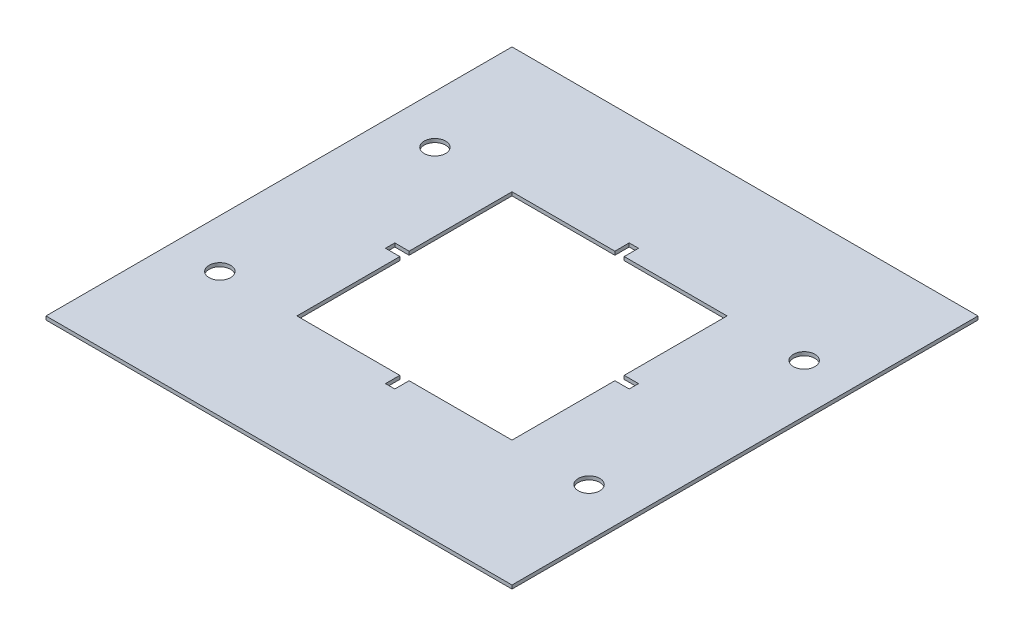
ISO-10303-21;
HEADER;
FILE_DESCRIPTION(('STEP AP214'),'2;1');
FILE_NAME('part.step','',(''),(''),'','','');
FILE_SCHEMA(('AUTOMOTIVE_DESIGN { 1 0 10303 214 1 1 1 1 }'));
ENDSEC;
DATA;
#1=APPLICATION_CONTEXT('core data for automotive mechanical design processes');
#2=APPLICATION_PROTOCOL_DEFINITION('international standard','automotive_design',2000,#1);
#3=PRODUCT_CONTEXT('',#1,'mechanical');
#4=PRODUCT('Part','Part','',(#3));
#5=PRODUCT_RELATED_PRODUCT_CATEGORY('part','',(#4));
#6=PRODUCT_DEFINITION_FORMATION('','',#4);
#7=PRODUCT_DEFINITION_CONTEXT('part definition',#1,'design');
#8=PRODUCT_DEFINITION('design','',#6,#7);
#9=PRODUCT_DEFINITION_SHAPE('','',#8);
#10=(LENGTH_UNIT() NAMED_UNIT(*) SI_UNIT(.MILLI.,.METRE.));
#11=(NAMED_UNIT(*) PLANE_ANGLE_UNIT() SI_UNIT($,.RADIAN.));
#12=(NAMED_UNIT(*) SI_UNIT($,.STERADIAN.) SOLID_ANGLE_UNIT());
#13=UNCERTAINTY_MEASURE_WITH_UNIT(LENGTH_MEASURE(1.E-05),#10,'distance_accuracy_value','');
#14=(GEOMETRIC_REPRESENTATION_CONTEXT(3) GLOBAL_UNCERTAINTY_ASSIGNED_CONTEXT((#13)) GLOBAL_UNIT_ASSIGNED_CONTEXT((#10,
#11,#12)) REPRESENTATION_CONTEXT('',''));
#15=CARTESIAN_POINT('',(0.,0.,0.));
#16=DIRECTION('',(0.,0.,1.));
#17=DIRECTION('',(1.,0.,0.));
#18=AXIS2_PLACEMENT_3D('',#15,#16,#17);
#19=CARTESIAN_POINT('',(0.,0.5,0.));
#20=DIRECTION('',(0.,-1.,0.));
#21=DIRECTION('',(0.,0.,-1.));
#22=AXIS2_PLACEMENT_3D('',#19,#20,#21);
#23=PLANE('',#22);
#24=DIRECTION('',(-1.,0.,0.));
#25=VECTOR('',#24,1.);
#26=CARTESIAN_POINT('',(28.15,0.5,-42.5));
#27=LINE('',#26,#25);
#28=CARTESIAN_POINT('',(42.5,0.5,-42.5));
#29=VERTEX_POINT('',#28);
#30=CARTESIAN_POINT('',(28.15,0.5,-42.5));
#31=VERTEX_POINT('',#30);
#32=EDGE_CURVE('E258',#29,#31,#27,.T.);
#33=ORIENTED_EDGE('',*,*,#32,.F.);
#34=DIRECTION('',(0.,0.,-1.));
#35=VECTOR('',#34,1.);
#36=CARTESIAN_POINT('',(42.5,0.5,-28.15));
#37=LINE('',#36,#35);
#38=CARTESIAN_POINT('',(42.5,0.5,-28.15));
#39=VERTEX_POINT('',#38);
#40=EDGE_CURVE('E297',#39,#29,#37,.T.);
#41=ORIENTED_EDGE('',*,*,#40,.F.);
#42=DIRECTION('',(-1.,0.,0.));
#43=VECTOR('',#42,1.);
#44=CARTESIAN_POINT('',(44.5,0.5,-28.15));
#45=LINE('',#44,#43);
#46=CARTESIAN_POINT('',(44.5,0.5,-28.15));
#47=VERTEX_POINT('',#46);
#48=EDGE_CURVE('E295',#47,#39,#45,.T.);
#49=ORIENTED_EDGE('',*,*,#48,.F.);
#50=DIRECTION('',(0.,0.,-1.));
#51=VECTOR('',#50,1.);
#52=CARTESIAN_POINT('',(44.5,0.5,-28.15));
#53=LINE('',#52,#51);
#54=CARTESIAN_POINT('',(44.5,0.5,-26.85));
#55=VERTEX_POINT('',#54);
#56=EDGE_CURVE('E293',#55,#47,#53,.T.);
#57=ORIENTED_EDGE('',*,*,#56,.F.);
#58=DIRECTION('',(1.,0.,0.));
#59=VECTOR('',#58,1.);
#60=CARTESIAN_POINT('',(44.5,0.5,-26.85));
#61=LINE('',#60,#59);
#62=CARTESIAN_POINT('',(42.5,0.5,-26.85));
#63=VERTEX_POINT('',#62);
#64=EDGE_CURVE('E291',#63,#55,#61,.T.);
#65=ORIENTED_EDGE('',*,*,#64,.F.);
#66=DIRECTION('',(0.,0.,-1.));
#67=VECTOR('',#66,1.);
#68=CARTESIAN_POINT('',(42.5,0.5,-12.5));
#69=LINE('',#68,#67);
#70=CARTESIAN_POINT('',(42.5,0.5,-12.5));
#71=VERTEX_POINT('',#70);
#72=EDGE_CURVE('E289',#71,#63,#69,.T.);
#73=ORIENTED_EDGE('',*,*,#72,.F.);
#74=DIRECTION('',(1.,0.,0.));
#75=VECTOR('',#74,1.);
#76=CARTESIAN_POINT('',(28.15,0.5,-12.5));
#77=LINE('',#76,#75);
#78=CARTESIAN_POINT('',(28.15,0.5,-12.5));
#79=VERTEX_POINT('',#78);
#80=EDGE_CURVE('E287',#79,#71,#77,.T.);
#81=ORIENTED_EDGE('',*,*,#80,.F.);
#82=DIRECTION('',(0.,0.,-1.));
#83=VECTOR('',#82,1.);
#84=CARTESIAN_POINT('',(28.15,0.5,-10.5));
#85=LINE('',#84,#83);
#86=CARTESIAN_POINT('',(28.15,0.5,-10.5));
#87=VERTEX_POINT('',#86);
#88=EDGE_CURVE('E285',#87,#79,#85,.T.);
#89=ORIENTED_EDGE('',*,*,#88,.F.);
#90=DIRECTION('',(1.,0.,0.));
#91=VECTOR('',#90,1.);
#92=CARTESIAN_POINT('',(26.85,0.5,-10.5));
#93=LINE('',#92,#91);
#94=CARTESIAN_POINT('',(26.85,0.5,-10.5));
#95=VERTEX_POINT('',#94);
#96=EDGE_CURVE('E283',#95,#87,#93,.T.);
#97=ORIENTED_EDGE('',*,*,#96,.F.);
#98=DIRECTION('',(0.,0.,1.));
#99=VECTOR('',#98,1.);
#100=CARTESIAN_POINT('',(26.85,0.5,-10.5));
#101=LINE('',#100,#99);
#102=CARTESIAN_POINT('',(26.85,0.5,-12.5));
#103=VERTEX_POINT('',#102);
#104=EDGE_CURVE('E281',#103,#95,#101,.T.);
#105=ORIENTED_EDGE('',*,*,#104,.F.);
#106=DIRECTION('',(1.,0.,0.));
#107=VECTOR('',#106,1.);
#108=CARTESIAN_POINT('',(12.5,0.5,-12.5));
#109=LINE('',#108,#107);
#110=CARTESIAN_POINT('',(12.5,0.5,-12.5));
#111=VERTEX_POINT('',#110);
#112=EDGE_CURVE('E279',#111,#103,#109,.T.);
#113=ORIENTED_EDGE('',*,*,#112,.F.);
#114=DIRECTION('',(0.,0.,1.));
#115=VECTOR('',#114,1.);
#116=CARTESIAN_POINT('',(12.5,0.5,-12.5));
#117=LINE('',#116,#115);
#118=CARTESIAN_POINT('',(12.5,0.5,-26.85));
#119=VERTEX_POINT('',#118);
#120=EDGE_CURVE('E277',#119,#111,#117,.T.);
#121=ORIENTED_EDGE('',*,*,#120,.F.);
#122=DIRECTION('',(1.,0.,0.));
#123=VECTOR('',#122,1.);
#124=CARTESIAN_POINT('',(10.5,0.5,-26.85));
#125=LINE('',#124,#123);
#126=CARTESIAN_POINT('',(10.5,0.5,-26.85));
#127=VERTEX_POINT('',#126);
#128=EDGE_CURVE('E275',#127,#119,#125,.T.);
#129=ORIENTED_EDGE('',*,*,#128,.F.);
#130=DIRECTION('',(0.,0.,1.));
#131=VECTOR('',#130,1.);
#132=CARTESIAN_POINT('',(10.5,0.5,-28.15));
#133=LINE('',#132,#131);
#134=CARTESIAN_POINT('',(10.5,0.5,-28.15));
#135=VERTEX_POINT('',#134);
#136=EDGE_CURVE('E273',#135,#127,#133,.T.);
#137=ORIENTED_EDGE('',*,*,#136,.F.);
#138=DIRECTION('',(-1.,0.,0.));
#139=VECTOR('',#138,1.);
#140=CARTESIAN_POINT('',(10.5,0.5,-28.15));
#141=LINE('',#140,#139);
#142=CARTESIAN_POINT('',(12.5,0.5,-28.15));
#143=VERTEX_POINT('',#142);
#144=EDGE_CURVE('E271',#143,#135,#141,.T.);
#145=ORIENTED_EDGE('',*,*,#144,.F.);
#146=DIRECTION('',(0.,0.,1.));
#147=VECTOR('',#146,1.);
#148=CARTESIAN_POINT('',(12.5,0.5,-28.15));
#149=LINE('',#148,#147);
#150=CARTESIAN_POINT('',(12.5,0.5,-42.5));
#151=VERTEX_POINT('',#150);
#152=EDGE_CURVE('E269',#151,#143,#149,.T.);
#153=ORIENTED_EDGE('',*,*,#152,.F.);
#154=DIRECTION('',(-1.,0.,0.));
#155=VECTOR('',#154,1.);
#156=CARTESIAN_POINT('',(12.5,0.5,-42.5));
#157=LINE('',#156,#155);
#158=CARTESIAN_POINT('',(26.85,0.5,-42.5));
#159=VERTEX_POINT('',#158);
#160=EDGE_CURVE('E267',#159,#151,#157,.T.);
#161=ORIENTED_EDGE('',*,*,#160,.F.);
#162=DIRECTION('',(0.,0.,1.));
#163=VECTOR('',#162,1.);
#164=CARTESIAN_POINT('',(26.85,0.5,-44.5));
#165=LINE('',#164,#163);
#166=CARTESIAN_POINT('',(26.85,0.5,-44.5));
#167=VERTEX_POINT('',#166);
#168=EDGE_CURVE('E265',#167,#159,#165,.T.);
#169=ORIENTED_EDGE('',*,*,#168,.F.);
#170=DIRECTION('',(-1.,0.,0.));
#171=VECTOR('',#170,1.);
#172=CARTESIAN_POINT('',(26.85,0.5,-44.5));
#173=LINE('',#172,#171);
#174=CARTESIAN_POINT('',(28.15,0.5,-44.5));
#175=VERTEX_POINT('',#174);
#176=EDGE_CURVE('E263',#175,#167,#173,.T.);
#177=ORIENTED_EDGE('',*,*,#176,.F.);
#178=DIRECTION('',(0.,0.,-1.));
#179=VECTOR('',#178,1.);
#180=CARTESIAN_POINT('',(28.15,0.5,-44.5));
#181=LINE('',#180,#179);
#182=EDGE_CURVE('E260',#31,#175,#181,.T.);
#183=ORIENTED_EDGE('',*,*,#182,.F.);
#184=EDGE_LOOP('',(#33,#41,#49,#57,#65,#73,#81,#89,#97,#105,#113,#121,#129,#137,#145,#153,#161,
#169,#177,#183));
#185=FACE_BOUND('',#184,.T.);
#186=CARTESIAN_POINT('',(1.75,0.5,-42.5));
#187=DIRECTION('',(0.,1.,0.));
#188=DIRECTION('',(0.,0.,1.));
#189=AXIS2_PLACEMENT_3D('',#186,#187,#188);
#190=CIRCLE('',#189,1.5);
#191=CARTESIAN_POINT('',(1.75,0.5,-41.));
#192=VERTEX_POINT('',#191);
#193=EDGE_CURVE('E253',#192,#192,#190,.T.);
#194=ORIENTED_EDGE('',*,*,#193,.F.);
#195=EDGE_LOOP('',(#194));
#196=FACE_BOUND('',#195,.T.);
#197=CARTESIAN_POINT('',(1.75,0.5,-12.5));
#198=DIRECTION('',(0.,1.,0.));
#199=DIRECTION('',(0.,0.,1.));
#200=AXIS2_PLACEMENT_3D('',#197,#198,#199);
#201=CIRCLE('',#200,1.5);
#202=CARTESIAN_POINT('',(1.75,0.5,-11.));
#203=VERTEX_POINT('',#202);
#204=EDGE_CURVE('E247',#203,#203,#201,.T.);
#205=ORIENTED_EDGE('',*,*,#204,.F.);
#206=EDGE_LOOP('',(#205));
#207=FACE_BOUND('',#206,.T.);
#208=CARTESIAN_POINT('',(53.25,0.5,-42.5));
#209=DIRECTION('',(0.,1.,0.));
#210=DIRECTION('',(0.,0.,-1.));
#211=AXIS2_PLACEMENT_3D('',#208,#209,#210);
#212=CIRCLE('',#211,1.5);
#213=CARTESIAN_POINT('',(53.25,0.5,-44.));
#214=VERTEX_POINT('',#213);
#215=EDGE_CURVE('E241',#214,#214,#212,.T.);
#216=ORIENTED_EDGE('',*,*,#215,.F.);
#217=EDGE_LOOP('',(#216));
#218=FACE_BOUND('',#217,.T.);
#219=CARTESIAN_POINT('',(53.25,0.5,-12.5));
#220=DIRECTION('',(0.,1.,0.));
#221=DIRECTION('',(0.,0.,-1.));
#222=AXIS2_PLACEMENT_3D('',#219,#220,#221);
#223=CIRCLE('',#222,1.5);
#224=CARTESIAN_POINT('',(53.25,0.5,-14.));
#225=VERTEX_POINT('',#224);
#226=EDGE_CURVE('E233',#225,#225,#223,.T.);
#227=ORIENTED_EDGE('',*,*,#226,.F.);
#228=EDGE_LOOP('',(#227));
#229=FACE_BOUND('',#228,.T.);
#230=DIRECTION('',(0.,0.,1.));
#231=VECTOR('',#230,1.);
#232=CARTESIAN_POINT('',(-4.99999999999999,0.5,5.));
#233=LINE('',#232,#231);
#234=CARTESIAN_POINT('',(-4.99999999999999,0.5,-60.));
#235=VERTEX_POINT('',#234);
#236=CARTESIAN_POINT('',(-4.99999999999999,0.5,5.));
#237=VERTEX_POINT('',#236);
#238=EDGE_CURVE('E218',#235,#237,#233,.T.);
#239=ORIENTED_EDGE('',*,*,#238,.T.);
#240=DIRECTION('',(1.,0.,0.));
#241=VECTOR('',#240,1.);
#242=CARTESIAN_POINT('',(-4.99999999999999,0.5,5.));
#243=LINE('',#242,#241);
#244=CARTESIAN_POINT('',(60.,0.5,4.99999999999999));
#245=VERTEX_POINT('',#244);
#246=EDGE_CURVE('E648',#237,#245,#243,.T.);
#247=ORIENTED_EDGE('',*,*,#246,.T.);
#248=DIRECTION('',(0.,0.,-1.));
#249=VECTOR('',#248,1.);
#250=CARTESIAN_POINT('',(60.,0.5,4.99999999999999));
#251=LINE('',#250,#249);
#252=CARTESIAN_POINT('',(60.,0.5,-60.));
#253=VERTEX_POINT('',#252);
#254=EDGE_CURVE('E214',#245,#253,#251,.T.);
#255=ORIENTED_EDGE('',*,*,#254,.T.);
#256=DIRECTION('',(-1.,0.,0.));
#257=VECTOR('',#256,1.);
#258=CARTESIAN_POINT('',(-4.99999999999999,0.5,-60.));
#259=LINE('',#258,#257);
#260=EDGE_CURVE('E240',#253,#235,#259,.T.);
#261=ORIENTED_EDGE('',*,*,#260,.T.);
#262=EDGE_LOOP('',(#239,#247,#255,#261));
#263=FACE_BOUND('',#262,.T.);
#264=ADVANCED_FACE('F37',(#185,#196,#207,#218,#229,#263),#23,.F.);
#265=CARTESIAN_POINT('',(0.,0.,0.));
#266=DIRECTION('',(0.,-1.,0.));
#267=DIRECTION('',(0.,0.,-1.));
#268=AXIS2_PLACEMENT_3D('',#265,#266,#267);
#269=PLANE('',#268);
#270=CARTESIAN_POINT('',(53.25,0.,-42.5));
#271=DIRECTION('',(0.,1.,0.));
#272=DIRECTION('',(0.,0.,-1.));
#273=AXIS2_PLACEMENT_3D('',#270,#271,#272);
#274=CIRCLE('',#273,1.5);
#275=CARTESIAN_POINT('',(53.25,0.,-44.));
#276=VERTEX_POINT('',#275);
#277=EDGE_CURVE('E236',#276,#276,#274,.T.);
#278=ORIENTED_EDGE('',*,*,#277,.T.);
#279=EDGE_LOOP('',(#278));
#280=FACE_BOUND('',#279,.T.);
#281=CARTESIAN_POINT('',(1.75,0.,-42.5));
#282=DIRECTION('',(0.,1.,0.));
#283=DIRECTION('',(0.,0.,1.));
#284=AXIS2_PLACEMENT_3D('',#281,#282,#283);
#285=CIRCLE('',#284,1.5);
#286=CARTESIAN_POINT('',(1.75,0.,-41.));
#287=VERTEX_POINT('',#286);
#288=EDGE_CURVE('E250',#287,#287,#285,.T.);
#289=ORIENTED_EDGE('',*,*,#288,.T.);
#290=EDGE_LOOP('',(#289));
#291=FACE_BOUND('',#290,.T.);
#292=DIRECTION('',(0.,0.,-1.));
#293=VECTOR('',#292,1.);
#294=CARTESIAN_POINT('',(42.5,0.,-28.15));
#295=LINE('',#294,#293);
#296=CARTESIAN_POINT('',(42.5,0.,-28.15));
#297=VERTEX_POINT('',#296);
#298=CARTESIAN_POINT('',(42.5,0.,-42.5));
#299=VERTEX_POINT('',#298);
#300=EDGE_CURVE('E261',#297,#299,#295,.T.);
#301=ORIENTED_EDGE('',*,*,#300,.T.);
#302=DIRECTION('',(-1.,0.,0.));
#303=VECTOR('',#302,1.);
#304=CARTESIAN_POINT('',(28.15,0.,-42.5));
#305=LINE('',#304,#303);
#306=CARTESIAN_POINT('',(28.15,0.,-42.5));
#307=VERTEX_POINT('',#306);
#308=EDGE_CURVE('E59',#299,#307,#305,.T.);
#309=ORIENTED_EDGE('',*,*,#308,.T.);
#310=DIRECTION('',(0.,0.,-1.));
#311=VECTOR('',#310,1.);
#312=CARTESIAN_POINT('',(28.15,0.,-44.5));
#313=LINE('',#312,#311);
#314=CARTESIAN_POINT('',(28.15,0.,-44.5));
#315=VERTEX_POINT('',#314);
#316=EDGE_CURVE('E301',#307,#315,#313,.T.);
#317=ORIENTED_EDGE('',*,*,#316,.T.);
#318=DIRECTION('',(-1.,0.,0.));
#319=VECTOR('',#318,1.);
#320=CARTESIAN_POINT('',(26.85,0.,-44.5));
#321=LINE('',#320,#319);
#322=CARTESIAN_POINT('',(26.85,0.,-44.5));
#323=VERTEX_POINT('',#322);
#324=EDGE_CURVE('E304',#315,#323,#321,.T.);
#325=ORIENTED_EDGE('',*,*,#324,.T.);
#326=DIRECTION('',(0.,0.,1.));
#327=VECTOR('',#326,1.);
#328=CARTESIAN_POINT('',(26.85,0.,-44.5));
#329=LINE('',#328,#327);
#330=CARTESIAN_POINT('',(26.85,0.,-42.5));
#331=VERTEX_POINT('',#330);
#332=EDGE_CURVE('E307',#323,#331,#329,.T.);
#333=ORIENTED_EDGE('',*,*,#332,.T.);
#334=DIRECTION('',(-1.,0.,0.));
#335=VECTOR('',#334,1.);
#336=CARTESIAN_POINT('',(12.5,0.,-42.5));
#337=LINE('',#336,#335);
#338=CARTESIAN_POINT('',(12.5,0.,-42.5));
#339=VERTEX_POINT('',#338);
#340=EDGE_CURVE('E310',#331,#339,#337,.T.);
#341=ORIENTED_EDGE('',*,*,#340,.T.);
#342=DIRECTION('',(0.,0.,1.));
#343=VECTOR('',#342,1.);
#344=CARTESIAN_POINT('',(12.5,0.,-28.15));
#345=LINE('',#344,#343);
#346=CARTESIAN_POINT('',(12.5,0.,-28.15));
#347=VERTEX_POINT('',#346);
#348=EDGE_CURVE('E313',#339,#347,#345,.T.);
#349=ORIENTED_EDGE('',*,*,#348,.T.);
#350=DIRECTION('',(-1.,0.,0.));
#351=VECTOR('',#350,1.);
#352=CARTESIAN_POINT('',(10.5,0.,-28.15));
#353=LINE('',#352,#351);
#354=CARTESIAN_POINT('',(10.5,0.,-28.15));
#355=VERTEX_POINT('',#354);
#356=EDGE_CURVE('E316',#347,#355,#353,.T.);
#357=ORIENTED_EDGE('',*,*,#356,.T.);
#358=DIRECTION('',(0.,0.,1.));
#359=VECTOR('',#358,1.);
#360=CARTESIAN_POINT('',(10.5,0.,-28.15));
#361=LINE('',#360,#359);
#362=CARTESIAN_POINT('',(10.5,0.,-26.85));
#363=VERTEX_POINT('',#362);
#364=EDGE_CURVE('E319',#355,#363,#361,.T.);
#365=ORIENTED_EDGE('',*,*,#364,.T.);
#366=DIRECTION('',(1.,0.,0.));
#367=VECTOR('',#366,1.);
#368=CARTESIAN_POINT('',(10.5,0.,-26.85));
#369=LINE('',#368,#367);
#370=CARTESIAN_POINT('',(12.5,0.,-26.85));
#371=VERTEX_POINT('',#370);
#372=EDGE_CURVE('E322',#363,#371,#369,.T.);
#373=ORIENTED_EDGE('',*,*,#372,.T.);
#374=DIRECTION('',(0.,0.,1.));
#375=VECTOR('',#374,1.);
#376=CARTESIAN_POINT('',(12.5,0.,-12.5));
#377=LINE('',#376,#375);
#378=CARTESIAN_POINT('',(12.5,0.,-12.5));
#379=VERTEX_POINT('',#378);
#380=EDGE_CURVE('E325',#371,#379,#377,.T.);
#381=ORIENTED_EDGE('',*,*,#380,.T.);
#382=DIRECTION('',(1.,0.,0.));
#383=VECTOR('',#382,1.);
#384=CARTESIAN_POINT('',(12.5,0.,-12.5));
#385=LINE('',#384,#383);
#386=CARTESIAN_POINT('',(26.85,0.,-12.5));
#387=VERTEX_POINT('',#386);
#388=EDGE_CURVE('E328',#379,#387,#385,.T.);
#389=ORIENTED_EDGE('',*,*,#388,.T.);
#390=DIRECTION('',(0.,0.,1.));
#391=VECTOR('',#390,1.);
#392=CARTESIAN_POINT('',(26.85,0.,-10.5));
#393=LINE('',#392,#391);
#394=CARTESIAN_POINT('',(26.85,0.,-10.5));
#395=VERTEX_POINT('',#394);
#396=EDGE_CURVE('E331',#387,#395,#393,.T.);
#397=ORIENTED_EDGE('',*,*,#396,.T.);
#398=DIRECTION('',(1.,0.,0.));
#399=VECTOR('',#398,1.);
#400=CARTESIAN_POINT('',(26.85,0.,-10.5));
#401=LINE('',#400,#399);
#402=CARTESIAN_POINT('',(28.15,0.,-10.5));
#403=VERTEX_POINT('',#402);
#404=EDGE_CURVE('E334',#395,#403,#401,.T.);
#405=ORIENTED_EDGE('',*,*,#404,.T.);
#406=DIRECTION('',(0.,0.,-1.));
#407=VECTOR('',#406,1.);
#408=CARTESIAN_POINT('',(28.15,0.,-10.5));
#409=LINE('',#408,#407);
#410=CARTESIAN_POINT('',(28.15,0.,-12.5));
#411=VERTEX_POINT('',#410);
#412=EDGE_CURVE('E337',#403,#411,#409,.T.);
#413=ORIENTED_EDGE('',*,*,#412,.T.);
#414=DIRECTION('',(1.,0.,0.));
#415=VECTOR('',#414,1.);
#416=CARTESIAN_POINT('',(28.15,0.,-12.5));
#417=LINE('',#416,#415);
#418=CARTESIAN_POINT('',(42.5,0.,-12.5));
#419=VERTEX_POINT('',#418);
#420=EDGE_CURVE('E340',#411,#419,#417,.T.);
#421=ORIENTED_EDGE('',*,*,#420,.T.);
#422=DIRECTION('',(0.,0.,-1.));
#423=VECTOR('',#422,1.);
#424=CARTESIAN_POINT('',(42.5,0.,-12.5));
#425=LINE('',#424,#423);
#426=CARTESIAN_POINT('',(42.5,0.,-26.85));
#427=VERTEX_POINT('',#426);
#428=EDGE_CURVE('E343',#419,#427,#425,.T.);
#429=ORIENTED_EDGE('',*,*,#428,.T.);
#430=DIRECTION('',(1.,0.,0.));
#431=VECTOR('',#430,1.);
#432=CARTESIAN_POINT('',(44.5,0.,-26.85));
#433=LINE('',#432,#431);
#434=CARTESIAN_POINT('',(44.5,0.,-26.85));
#435=VERTEX_POINT('',#434);
#436=EDGE_CURVE('E346',#427,#435,#433,.T.);
#437=ORIENTED_EDGE('',*,*,#436,.T.);
#438=DIRECTION('',(0.,0.,-1.));
#439=VECTOR('',#438,1.);
#440=CARTESIAN_POINT('',(44.5,0.,-28.15));
#441=LINE('',#440,#439);
#442=CARTESIAN_POINT('',(44.5,0.,-28.15));
#443=VERTEX_POINT('',#442);
#444=EDGE_CURVE('E349',#435,#443,#441,.T.);
#445=ORIENTED_EDGE('',*,*,#444,.T.);
#446=DIRECTION('',(-1.,0.,0.));
#447=VECTOR('',#446,1.);
#448=CARTESIAN_POINT('',(44.5,0.,-28.15));
#449=LINE('',#448,#447);
#450=EDGE_CURVE('E352',#443,#297,#449,.T.);
#451=ORIENTED_EDGE('',*,*,#450,.T.);
#452=EDGE_LOOP('',(#301,#309,#317,#325,#333,#341,#349,#357,#365,#373,#381,#389,#397,#405,#413,
#421,#429,#437,#445,#451));
#453=FACE_BOUND('',#452,.T.);
#454=CARTESIAN_POINT('',(1.75,0.,-12.5));
#455=DIRECTION('',(0.,1.,0.));
#456=DIRECTION('',(0.,0.,1.));
#457=AXIS2_PLACEMENT_3D('',#454,#455,#456);
#458=CIRCLE('',#457,1.5);
#459=CARTESIAN_POINT('',(1.75,0.,-11.));
#460=VERTEX_POINT('',#459);
#461=EDGE_CURVE('E244',#460,#460,#458,.T.);
#462=ORIENTED_EDGE('',*,*,#461,.T.);
#463=EDGE_LOOP('',(#462));
#464=FACE_BOUND('',#463,.T.);
#465=CARTESIAN_POINT('',(53.25,0.,-12.5));
#466=DIRECTION('',(0.,1.,0.));
#467=DIRECTION('',(0.,0.,-1.));
#468=AXIS2_PLACEMENT_3D('',#465,#466,#467);
#469=CIRCLE('',#468,1.5);
#470=CARTESIAN_POINT('',(53.25,0.,-14.));
#471=VERTEX_POINT('',#470);
#472=EDGE_CURVE('E237',#471,#471,#469,.T.);
#473=ORIENTED_EDGE('',*,*,#472,.T.);
#474=EDGE_LOOP('',(#473));
#475=FACE_BOUND('',#474,.T.);
#476=DIRECTION('',(0.,0.,1.));
#477=VECTOR('',#476,1.);
#478=CARTESIAN_POINT('',(-4.99999999999999,0.,5.));
#479=LINE('',#478,#477);
#480=CARTESIAN_POINT('',(-4.99999999999999,0.,-60.));
#481=VERTEX_POINT('',#480);
#482=CARTESIAN_POINT('',(-4.99999999999999,0.,5.));
#483=VERTEX_POINT('',#482);
#484=EDGE_CURVE('E228',#481,#483,#479,.T.);
#485=ORIENTED_EDGE('',*,*,#484,.F.);
#486=DIRECTION('',(-1.,0.,0.));
#487=VECTOR('',#486,1.);
#488=CARTESIAN_POINT('',(-4.99999999999999,0.,-60.));
#489=LINE('',#488,#487);
#490=CARTESIAN_POINT('',(60.,0.,-60.));
#491=VERTEX_POINT('',#490);
#492=EDGE_CURVE('E204',#491,#481,#489,.T.);
#493=ORIENTED_EDGE('',*,*,#492,.F.);
#494=DIRECTION('',(0.,0.,-1.));
#495=VECTOR('',#494,1.);
#496=CARTESIAN_POINT('',(60.,0.,4.99999999999999));
#497=LINE('',#496,#495);
#498=CARTESIAN_POINT('',(60.,0.,4.99999999999999));
#499=VERTEX_POINT('',#498);
#500=EDGE_CURVE('E198',#499,#491,#497,.T.);
#501=ORIENTED_EDGE('',*,*,#500,.F.);
#502=DIRECTION('',(1.,0.,0.));
#503=VECTOR('',#502,1.);
#504=CARTESIAN_POINT('',(-4.99999999999999,0.,5.));
#505=LINE('',#504,#503);
#506=EDGE_CURVE('E201',#483,#499,#505,.T.);
#507=ORIENTED_EDGE('',*,*,#506,.F.);
#508=EDGE_LOOP('',(#485,#493,#501,#507));
#509=FACE_BOUND('',#508,.T.);
#510=ADVANCED_FACE('F39',(#280,#291,#453,#464,#475,#509),#269,.T.);
#511=CARTESIAN_POINT('',(28.15,0.5,-42.5));
#512=DIRECTION('',(0.,0.,1.));
#513=DIRECTION('',(1.,0.,0.));
#514=AXIS2_PLACEMENT_3D('',#511,#512,#513);
#515=PLANE('',#514);
#516=ORIENTED_EDGE('',*,*,#308,.F.);
#517=DIRECTION('',(0.,-1.,0.));
#518=VECTOR('',#517,1.);
#519=CARTESIAN_POINT('',(42.5,0.5,-42.5));
#520=LINE('',#519,#518);
#521=EDGE_CURVE('E299',#29,#299,#520,.T.);
#522=ORIENTED_EDGE('',*,*,#521,.F.);
#523=ORIENTED_EDGE('',*,*,#32,.T.);
#524=DIRECTION('',(0.,-1.,0.));
#525=VECTOR('',#524,1.);
#526=CARTESIAN_POINT('',(28.15,0.5,-42.5));
#527=LINE('',#526,#525);
#528=EDGE_CURVE('E11',#31,#307,#527,.T.);
#529=ORIENTED_EDGE('',*,*,#528,.T.);
#530=EDGE_LOOP('',(#516,#522,#523,#529));
#531=FACE_BOUND('',#530,.T.);
#532=ADVANCED_FACE('F407',(#531),#515,.T.);
#533=CARTESIAN_POINT('',(28.15,0.5,-44.5));
#534=DIRECTION('',(-1.,0.,0.));
#535=DIRECTION('',(0.,0.,1.));
#536=AXIS2_PLACEMENT_3D('',#533,#534,#535);
#537=PLANE('',#536);
#538=ORIENTED_EDGE('',*,*,#316,.F.);
#539=ORIENTED_EDGE('',*,*,#528,.F.);
#540=ORIENTED_EDGE('',*,*,#182,.T.);
#541=DIRECTION('',(0.,-1.,0.));
#542=VECTOR('',#541,1.);
#543=CARTESIAN_POINT('',(28.15,0.5,-44.5));
#544=LINE('',#543,#542);
#545=EDGE_CURVE('E45',#175,#315,#544,.T.);
#546=ORIENTED_EDGE('',*,*,#545,.T.);
#547=EDGE_LOOP('',(#538,#539,#540,#546));
#548=FACE_BOUND('',#547,.T.);
#549=ADVANCED_FACE('F393',(#548),#537,.T.);
#550=CARTESIAN_POINT('',(26.85,0.5,-44.5));
#551=DIRECTION('',(0.,0.,1.));
#552=DIRECTION('',(1.,0.,0.));
#553=AXIS2_PLACEMENT_3D('',#550,#551,#552);
#554=PLANE('',#553);
#555=ORIENTED_EDGE('',*,*,#324,.F.);
#556=ORIENTED_EDGE('',*,*,#545,.F.);
#557=ORIENTED_EDGE('',*,*,#176,.T.);
#558=DIRECTION('',(0.,-1.,0.));
#559=VECTOR('',#558,1.);
#560=CARTESIAN_POINT('',(26.85,0.5,-44.5));
#561=LINE('',#560,#559);
#562=EDGE_CURVE('E389',#167,#323,#561,.T.);
#563=ORIENTED_EDGE('',*,*,#562,.T.);
#564=EDGE_LOOP('',(#555,#556,#557,#563));
#565=FACE_BOUND('',#564,.T.);
#566=ADVANCED_FACE('F398',(#565),#554,.T.);
#567=CARTESIAN_POINT('',(26.85,0.5,-44.5));
#568=DIRECTION('',(1.,0.,0.));
#569=DIRECTION('',(0.,0.,-1.));
#570=AXIS2_PLACEMENT_3D('',#567,#568,#569);
#571=PLANE('',#570);
#572=ORIENTED_EDGE('',*,*,#332,.F.);
#573=ORIENTED_EDGE('',*,*,#562,.F.);
#574=ORIENTED_EDGE('',*,*,#168,.T.);
#575=DIRECTION('',(0.,-1.,0.));
#576=VECTOR('',#575,1.);
#577=CARTESIAN_POINT('',(26.85,0.5,-42.5));
#578=LINE('',#577,#576);
#579=EDGE_CURVE('E387',#159,#331,#578,.T.);
#580=ORIENTED_EDGE('',*,*,#579,.T.);
#581=EDGE_LOOP('',(#572,#573,#574,#580));
#582=FACE_BOUND('',#581,.T.);
#583=ADVANCED_FACE('F414',(#582),#571,.T.);
#584=CARTESIAN_POINT('',(12.5,0.5,-42.5));
#585=DIRECTION('',(0.,0.,1.));
#586=DIRECTION('',(1.,0.,0.));
#587=AXIS2_PLACEMENT_3D('',#584,#585,#586);
#588=PLANE('',#587);
#589=ORIENTED_EDGE('',*,*,#340,.F.);
#590=ORIENTED_EDGE('',*,*,#579,.F.);
#591=ORIENTED_EDGE('',*,*,#160,.T.);
#592=DIRECTION('',(0.,-1.,0.));
#593=VECTOR('',#592,1.);
#594=CARTESIAN_POINT('',(12.5,0.5,-42.5));
#595=LINE('',#594,#593);
#596=EDGE_CURVE('E385',#151,#339,#595,.T.);
#597=ORIENTED_EDGE('',*,*,#596,.T.);
#598=EDGE_LOOP('',(#589,#590,#591,#597));
#599=FACE_BOUND('',#598,.T.);
#600=ADVANCED_FACE('F419',(#599),#588,.T.);
#601=CARTESIAN_POINT('',(12.5,0.5,-28.15));
#602=DIRECTION('',(1.,0.,0.));
#603=DIRECTION('',(0.,0.,-1.));
#604=AXIS2_PLACEMENT_3D('',#601,#602,#603);
#605=PLANE('',#604);
#606=ORIENTED_EDGE('',*,*,#348,.F.);
#607=ORIENTED_EDGE('',*,*,#596,.F.);
#608=ORIENTED_EDGE('',*,*,#152,.T.);
#609=DIRECTION('',(0.,-1.,0.));
#610=VECTOR('',#609,1.);
#611=CARTESIAN_POINT('',(12.5,0.5,-28.15));
#612=LINE('',#611,#610);
#613=EDGE_CURVE('E383',#143,#347,#612,.T.);
#614=ORIENTED_EDGE('',*,*,#613,.T.);
#615=EDGE_LOOP('',(#606,#607,#608,#614));
#616=FACE_BOUND('',#615,.T.);
#617=ADVANCED_FACE('F423',(#616),#605,.T.);
#618=CARTESIAN_POINT('',(10.5,0.5,-28.15));
#619=DIRECTION('',(0.,0.,1.));
#620=DIRECTION('',(1.,0.,0.));
#621=AXIS2_PLACEMENT_3D('',#618,#619,#620);
#622=PLANE('',#621);
#623=ORIENTED_EDGE('',*,*,#356,.F.);
#624=ORIENTED_EDGE('',*,*,#613,.F.);
#625=ORIENTED_EDGE('',*,*,#144,.T.);
#626=DIRECTION('',(0.,-1.,0.));
#627=VECTOR('',#626,1.);
#628=CARTESIAN_POINT('',(10.5,0.5,-28.15));
#629=LINE('',#628,#627);
#630=EDGE_CURVE('E381',#135,#355,#629,.T.);
#631=ORIENTED_EDGE('',*,*,#630,.T.);
#632=EDGE_LOOP('',(#623,#624,#625,#631));
#633=FACE_BOUND('',#632,.T.);
#634=ADVANCED_FACE('F428',(#633),#622,.T.);
#635=CARTESIAN_POINT('',(10.5,0.5,-28.15));
#636=DIRECTION('',(1.,0.,0.));
#637=DIRECTION('',(0.,0.,-1.));
#638=AXIS2_PLACEMENT_3D('',#635,#636,#637);
#639=PLANE('',#638);
#640=ORIENTED_EDGE('',*,*,#364,.F.);
#641=ORIENTED_EDGE('',*,*,#630,.F.);
#642=ORIENTED_EDGE('',*,*,#136,.T.);
#643=DIRECTION('',(0.,-1.,0.));
#644=VECTOR('',#643,1.);
#645=CARTESIAN_POINT('',(10.5,0.5,-26.85));
#646=LINE('',#645,#644);
#647=EDGE_CURVE('E379',#127,#363,#646,.T.);
#648=ORIENTED_EDGE('',*,*,#647,.T.);
#649=EDGE_LOOP('',(#640,#641,#642,#648));
#650=FACE_BOUND('',#649,.T.);
#651=ADVANCED_FACE('F433',(#650),#639,.T.);
#652=CARTESIAN_POINT('',(10.5,0.5,-26.85));
#653=DIRECTION('',(0.,0.,-1.));
#654=DIRECTION('',(-1.,0.,0.));
#655=AXIS2_PLACEMENT_3D('',#652,#653,#654);
#656=PLANE('',#655);
#657=ORIENTED_EDGE('',*,*,#372,.F.);
#658=ORIENTED_EDGE('',*,*,#647,.F.);
#659=ORIENTED_EDGE('',*,*,#128,.T.);
#660=DIRECTION('',(0.,-1.,0.));
#661=VECTOR('',#660,1.);
#662=CARTESIAN_POINT('',(12.5,0.5,-26.85));
#663=LINE('',#662,#661);
#664=EDGE_CURVE('E377',#119,#371,#663,.T.);
#665=ORIENTED_EDGE('',*,*,#664,.T.);
#666=EDGE_LOOP('',(#657,#658,#659,#665));
#667=FACE_BOUND('',#666,.T.);
#668=ADVANCED_FACE('F438',(#667),#656,.T.);
#669=CARTESIAN_POINT('',(12.5,0.5,-12.5));
#670=DIRECTION('',(1.,0.,0.));
#671=DIRECTION('',(0.,0.,-1.));
#672=AXIS2_PLACEMENT_3D('',#669,#670,#671);
#673=PLANE('',#672);
#674=ORIENTED_EDGE('',*,*,#380,.F.);
#675=ORIENTED_EDGE('',*,*,#664,.F.);
#676=ORIENTED_EDGE('',*,*,#120,.T.);
#677=DIRECTION('',(0.,-1.,0.));
#678=VECTOR('',#677,1.);
#679=CARTESIAN_POINT('',(12.5,0.5,-12.5));
#680=LINE('',#679,#678);
#681=EDGE_CURVE('E375',#111,#379,#680,.T.);
#682=ORIENTED_EDGE('',*,*,#681,.T.);
#683=EDGE_LOOP('',(#674,#675,#676,#682));
#684=FACE_BOUND('',#683,.T.);
#685=ADVANCED_FACE('F443',(#684),#673,.T.);
#686=CARTESIAN_POINT('',(12.5,0.5,-12.5));
#687=DIRECTION('',(0.,0.,-1.));
#688=DIRECTION('',(-1.,0.,0.));
#689=AXIS2_PLACEMENT_3D('',#686,#687,#688);
#690=PLANE('',#689);
#691=ORIENTED_EDGE('',*,*,#388,.F.);
#692=ORIENTED_EDGE('',*,*,#681,.F.);
#693=ORIENTED_EDGE('',*,*,#112,.T.);
#694=DIRECTION('',(0.,-1.,0.));
#695=VECTOR('',#694,1.);
#696=CARTESIAN_POINT('',(26.85,0.5,-12.5));
#697=LINE('',#696,#695);
#698=EDGE_CURVE('E373',#103,#387,#697,.T.);
#699=ORIENTED_EDGE('',*,*,#698,.T.);
#700=EDGE_LOOP('',(#691,#692,#693,#699));
#701=FACE_BOUND('',#700,.T.);
#702=ADVANCED_FACE('F448',(#701),#690,.T.);
#703=CARTESIAN_POINT('',(26.85,0.5,-10.5));
#704=DIRECTION('',(1.,0.,0.));
#705=DIRECTION('',(0.,0.,-1.));
#706=AXIS2_PLACEMENT_3D('',#703,#704,#705);
#707=PLANE('',#706);
#708=ORIENTED_EDGE('',*,*,#396,.F.);
#709=ORIENTED_EDGE('',*,*,#698,.F.);
#710=ORIENTED_EDGE('',*,*,#104,.T.);
#711=DIRECTION('',(0.,-1.,0.));
#712=VECTOR('',#711,1.);
#713=CARTESIAN_POINT('',(26.85,0.5,-10.5));
#714=LINE('',#713,#712);
#715=EDGE_CURVE('E371',#95,#395,#714,.T.);
#716=ORIENTED_EDGE('',*,*,#715,.T.);
#717=EDGE_LOOP('',(#708,#709,#710,#716));
#718=FACE_BOUND('',#717,.T.);
#719=ADVANCED_FACE('F453',(#718),#707,.T.);
#720=CARTESIAN_POINT('',(26.85,0.5,-10.5));
#721=DIRECTION('',(0.,0.,-1.));
#722=DIRECTION('',(-1.,0.,0.));
#723=AXIS2_PLACEMENT_3D('',#720,#721,#722);
#724=PLANE('',#723);
#725=ORIENTED_EDGE('',*,*,#404,.F.);
#726=ORIENTED_EDGE('',*,*,#715,.F.);
#727=ORIENTED_EDGE('',*,*,#96,.T.);
#728=DIRECTION('',(0.,-1.,0.));
#729=VECTOR('',#728,1.);
#730=CARTESIAN_POINT('',(28.15,0.5,-10.5));
#731=LINE('',#730,#729);
#732=EDGE_CURVE('E369',#87,#403,#731,.T.);
#733=ORIENTED_EDGE('',*,*,#732,.T.);
#734=EDGE_LOOP('',(#725,#726,#727,#733));
#735=FACE_BOUND('',#734,.T.);
#736=ADVANCED_FACE('F458',(#735),#724,.T.);
#737=CARTESIAN_POINT('',(28.15,0.5,-10.5));
#738=DIRECTION('',(-1.,0.,0.));
#739=DIRECTION('',(0.,0.,1.));
#740=AXIS2_PLACEMENT_3D('',#737,#738,#739);
#741=PLANE('',#740);
#742=ORIENTED_EDGE('',*,*,#412,.F.);
#743=ORIENTED_EDGE('',*,*,#732,.F.);
#744=ORIENTED_EDGE('',*,*,#88,.T.);
#745=DIRECTION('',(0.,-1.,0.));
#746=VECTOR('',#745,1.);
#747=CARTESIAN_POINT('',(28.15,0.5,-12.5));
#748=LINE('',#747,#746);
#749=EDGE_CURVE('E367',#79,#411,#748,.T.);
#750=ORIENTED_EDGE('',*,*,#749,.T.);
#751=EDGE_LOOP('',(#742,#743,#744,#750));
#752=FACE_BOUND('',#751,.T.);
#753=ADVANCED_FACE('F463',(#752),#741,.T.);
#754=CARTESIAN_POINT('',(28.15,0.5,-12.5));
#755=DIRECTION('',(0.,0.,-1.));
#756=DIRECTION('',(-1.,0.,0.));
#757=AXIS2_PLACEMENT_3D('',#754,#755,#756);
#758=PLANE('',#757);
#759=ORIENTED_EDGE('',*,*,#420,.F.);
#760=ORIENTED_EDGE('',*,*,#749,.F.);
#761=ORIENTED_EDGE('',*,*,#80,.T.);
#762=DIRECTION('',(0.,-1.,0.));
#763=VECTOR('',#762,1.);
#764=CARTESIAN_POINT('',(42.5,0.5,-12.5));
#765=LINE('',#764,#763);
#766=EDGE_CURVE('E365',#71,#419,#765,.T.);
#767=ORIENTED_EDGE('',*,*,#766,.T.);
#768=EDGE_LOOP('',(#759,#760,#761,#767));
#769=FACE_BOUND('',#768,.T.);
#770=ADVANCED_FACE('F468',(#769),#758,.T.);
#771=CARTESIAN_POINT('',(42.5,0.5,-12.5));
#772=DIRECTION('',(-1.,0.,0.));
#773=DIRECTION('',(0.,0.,1.));
#774=AXIS2_PLACEMENT_3D('',#771,#772,#773);
#775=PLANE('',#774);
#776=ORIENTED_EDGE('',*,*,#428,.F.);
#777=ORIENTED_EDGE('',*,*,#766,.F.);
#778=ORIENTED_EDGE('',*,*,#72,.T.);
#779=DIRECTION('',(0.,-1.,0.));
#780=VECTOR('',#779,1.);
#781=CARTESIAN_POINT('',(42.5,0.5,-26.85));
#782=LINE('',#781,#780);
#783=EDGE_CURVE('E363',#63,#427,#782,.T.);
#784=ORIENTED_EDGE('',*,*,#783,.T.);
#785=EDGE_LOOP('',(#776,#777,#778,#784));
#786=FACE_BOUND('',#785,.T.);
#787=ADVANCED_FACE('F473',(#786),#775,.T.);
#788=CARTESIAN_POINT('',(44.5,0.5,-26.85));
#789=DIRECTION('',(0.,0.,-1.));
#790=DIRECTION('',(-1.,0.,0.));
#791=AXIS2_PLACEMENT_3D('',#788,#789,#790);
#792=PLANE('',#791);
#793=ORIENTED_EDGE('',*,*,#436,.F.);
#794=ORIENTED_EDGE('',*,*,#783,.F.);
#795=ORIENTED_EDGE('',*,*,#64,.T.);
#796=DIRECTION('',(0.,-1.,0.));
#797=VECTOR('',#796,1.);
#798=CARTESIAN_POINT('',(44.5,0.5,-26.85));
#799=LINE('',#798,#797);
#800=EDGE_CURVE('E361',#55,#435,#799,.T.);
#801=ORIENTED_EDGE('',*,*,#800,.T.);
#802=EDGE_LOOP('',(#793,#794,#795,#801));
#803=FACE_BOUND('',#802,.T.);
#804=ADVANCED_FACE('F478',(#803),#792,.T.);
#805=CARTESIAN_POINT('',(44.5,0.5,-28.15));
#806=DIRECTION('',(-1.,0.,0.));
#807=DIRECTION('',(0.,0.,1.));
#808=AXIS2_PLACEMENT_3D('',#805,#806,#807);
#809=PLANE('',#808);
#810=ORIENTED_EDGE('',*,*,#444,.F.);
#811=ORIENTED_EDGE('',*,*,#800,.F.);
#812=ORIENTED_EDGE('',*,*,#56,.T.);
#813=DIRECTION('',(0.,-1.,0.));
#814=VECTOR('',#813,1.);
#815=CARTESIAN_POINT('',(44.5,0.5,-28.15));
#816=LINE('',#815,#814);
#817=EDGE_CURVE('E359',#47,#443,#816,.T.);
#818=ORIENTED_EDGE('',*,*,#817,.T.);
#819=EDGE_LOOP('',(#810,#811,#812,#818));
#820=FACE_BOUND('',#819,.T.);
#821=ADVANCED_FACE('F483',(#820),#809,.T.);
#822=CARTESIAN_POINT('',(44.5,0.5,-28.15));
#823=DIRECTION('',(0.,0.,1.));
#824=DIRECTION('',(1.,0.,0.));
#825=AXIS2_PLACEMENT_3D('',#822,#823,#824);
#826=PLANE('',#825);
#827=ORIENTED_EDGE('',*,*,#450,.F.);
#828=ORIENTED_EDGE('',*,*,#817,.F.);
#829=ORIENTED_EDGE('',*,*,#48,.T.);
#830=DIRECTION('',(0.,-1.,0.));
#831=VECTOR('',#830,1.);
#832=CARTESIAN_POINT('',(42.5,0.5,-28.15));
#833=LINE('',#832,#831);
#834=EDGE_CURVE('E52',#39,#297,#833,.T.);
#835=ORIENTED_EDGE('',*,*,#834,.T.);
#836=EDGE_LOOP('',(#827,#828,#829,#835));
#837=FACE_BOUND('',#836,.T.);
#838=ADVANCED_FACE('F486',(#837),#826,.T.);
#839=CARTESIAN_POINT('',(42.5,0.5,-28.15));
#840=DIRECTION('',(-1.,0.,0.));
#841=DIRECTION('',(0.,0.,1.));
#842=AXIS2_PLACEMENT_3D('',#839,#840,#841);
#843=PLANE('',#842);
#844=ORIENTED_EDGE('',*,*,#300,.F.);
#845=ORIENTED_EDGE('',*,*,#834,.F.);
#846=ORIENTED_EDGE('',*,*,#40,.T.);
#847=ORIENTED_EDGE('',*,*,#521,.T.);
#848=EDGE_LOOP('',(#844,#845,#846,#847));
#849=FACE_BOUND('',#848,.T.);
#850=ADVANCED_FACE('F404',(#849),#843,.T.);
#851=CARTESIAN_POINT('',(1.75,0.5,-42.5));
#852=DIRECTION('',(0.,-1.,0.));
#853=DIRECTION('',(0.,0.,-1.));
#854=AXIS2_PLACEMENT_3D('',#851,#852,#853);
#855=CYLINDRICAL_SURFACE('',#854,1.5);
#856=ORIENTED_EDGE('',*,*,#193,.T.);
#857=EDGE_LOOP('',(#856));
#858=FACE_BOUND('',#857,.T.);
#859=ORIENTED_EDGE('',*,*,#288,.F.);
#860=EDGE_LOOP('',(#859));
#861=FACE_BOUND('',#860,.T.);
#862=ADVANCED_FACE('F493',(#858,#861),#855,.F.);
#863=CARTESIAN_POINT('',(1.75,0.5,-12.5));
#864=DIRECTION('',(0.,-1.,0.));
#865=DIRECTION('',(0.,0.,-1.));
#866=AXIS2_PLACEMENT_3D('',#863,#864,#865);
#867=CYLINDRICAL_SURFACE('',#866,1.5);
#868=ORIENTED_EDGE('',*,*,#204,.T.);
#869=EDGE_LOOP('',(#868));
#870=FACE_BOUND('',#869,.T.);
#871=ORIENTED_EDGE('',*,*,#461,.F.);
#872=EDGE_LOOP('',(#871));
#873=FACE_BOUND('',#872,.T.);
#874=ADVANCED_FACE('F562',(#870,#873),#867,.F.);
#875=CARTESIAN_POINT('',(53.25,0.5,-42.5));
#876=DIRECTION('',(0.,-1.,0.));
#877=DIRECTION('',(0.,0.,-1.));
#878=AXIS2_PLACEMENT_3D('',#875,#876,#877);
#879=CYLINDRICAL_SURFACE('',#878,1.5);
#880=ORIENTED_EDGE('',*,*,#215,.T.);
#881=EDGE_LOOP('',(#880));
#882=FACE_BOUND('',#881,.T.);
#883=ORIENTED_EDGE('',*,*,#277,.F.);
#884=EDGE_LOOP('',(#883));
#885=FACE_BOUND('',#884,.T.);
#886=ADVANCED_FACE('F572',(#882,#885),#879,.F.);
#887=CARTESIAN_POINT('',(53.25,0.5,-12.5));
#888=DIRECTION('',(0.,-1.,0.));
#889=DIRECTION('',(0.,0.,-1.));
#890=AXIS2_PLACEMENT_3D('',#887,#888,#889);
#891=CYLINDRICAL_SURFACE('',#890,1.5);
#892=ORIENTED_EDGE('',*,*,#226,.T.);
#893=EDGE_LOOP('',(#892));
#894=FACE_BOUND('',#893,.T.);
#895=ORIENTED_EDGE('',*,*,#472,.F.);
#896=EDGE_LOOP('',(#895));
#897=FACE_BOUND('',#896,.T.);
#898=ADVANCED_FACE('F582',(#894,#897),#891,.F.);
#899=CARTESIAN_POINT('',(-4.99999999999999,-91.9238815542512,5.));
#900=DIRECTION('',(-1.,0.,0.));
#901=DIRECTION('',(0.,0.,1.));
#902=AXIS2_PLACEMENT_3D('',#899,#900,#901);
#903=PLANE('',#902);
#904=DIRECTION('',(0.,1.,0.));
#905=VECTOR('',#904,1.);
#906=CARTESIAN_POINT('',(-4.99999999999999,-91.9238815542512,-60.));
#907=LINE('',#906,#905);
#908=EDGE_CURVE('E208',#481,#235,#907,.T.);
#909=ORIENTED_EDGE('',*,*,#908,.F.);
#910=ORIENTED_EDGE('',*,*,#484,.T.);
#911=DIRECTION('',(0.,1.,0.));
#912=VECTOR('',#911,1.);
#913=CARTESIAN_POINT('',(-4.99999999999999,-91.9238815542512,5.));
#914=LINE('',#913,#912);
#915=EDGE_CURVE('E222',#483,#237,#914,.T.);
#916=ORIENTED_EDGE('',*,*,#915,.T.);
#917=ORIENTED_EDGE('',*,*,#238,.F.);
#918=EDGE_LOOP('',(#909,#910,#916,#917));
#919=FACE_BOUND('',#918,.T.);
#920=ADVANCED_FACE('F591',(#919),#903,.T.);
#921=CARTESIAN_POINT('',(-4.99999999999999,-91.9238815542512,-60.));
#922=DIRECTION('',(0.,0.,-1.));
#923=DIRECTION('',(-1.,0.,0.));
#924=AXIS2_PLACEMENT_3D('',#921,#922,#923);
#925=PLANE('',#924);
#926=DIRECTION('',(0.,1.,0.));
#927=VECTOR('',#926,1.);
#928=CARTESIAN_POINT('',(60.,-91.9238815542512,-60.));
#929=LINE('',#928,#927);
#930=EDGE_CURVE('E207',#491,#253,#929,.T.);
#931=ORIENTED_EDGE('',*,*,#930,.F.);
#932=ORIENTED_EDGE('',*,*,#492,.T.);
#933=ORIENTED_EDGE('',*,*,#908,.T.);
#934=ORIENTED_EDGE('',*,*,#260,.F.);
#935=EDGE_LOOP('',(#931,#932,#933,#934));
#936=FACE_BOUND('',#935,.T.);
#937=ADVANCED_FACE('F614',(#936),#925,.T.);
#938=CARTESIAN_POINT('',(60.,-91.9238815542512,4.99999999999999));
#939=DIRECTION('',(1.,0.,0.));
#940=DIRECTION('',(0.,0.,-1.));
#941=AXIS2_PLACEMENT_3D('',#938,#939,#940);
#942=PLANE('',#941);
#943=DIRECTION('',(0.,1.,0.));
#944=VECTOR('',#943,1.);
#945=CARTESIAN_POINT('',(60.,-91.9238815542512,4.99999999999999));
#946=LINE('',#945,#944);
#947=EDGE_CURVE('E211',#499,#245,#946,.T.);
#948=ORIENTED_EDGE('',*,*,#947,.F.);
#949=ORIENTED_EDGE('',*,*,#500,.T.);
#950=ORIENTED_EDGE('',*,*,#930,.T.);
#951=ORIENTED_EDGE('',*,*,#254,.F.);
#952=EDGE_LOOP('',(#948,#949,#950,#951));
#953=FACE_BOUND('',#952,.T.);
#954=ADVANCED_FACE('F212',(#953),#942,.T.);
#955=CARTESIAN_POINT('',(-4.99999999999999,-91.9238815542512,5.));
#956=DIRECTION('',(0.,0.,1.));
#957=DIRECTION('',(1.,0.,0.));
#958=AXIS2_PLACEMENT_3D('',#955,#956,#957);
#959=PLANE('',#958);
#960=ORIENTED_EDGE('',*,*,#915,.F.);
#961=ORIENTED_EDGE('',*,*,#506,.T.);
#962=ORIENTED_EDGE('',*,*,#947,.T.);
#963=ORIENTED_EDGE('',*,*,#246,.F.);
#964=EDGE_LOOP('',(#960,#961,#962,#963));
#965=FACE_BOUND('',#964,.T.);
#966=ADVANCED_FACE('F221',(#965),#959,.T.);
#967=CLOSED_SHELL('',(#264,#510,#532,#549,#566,#583,#600,#617,#634,#651,#668,#685,#702,#719,
#736,#753,#770,#787,#804,#821,#838,#850,#862,#874,#886,#898,#920,#937,#954,#966));
#968=MANIFOLD_SOLID_BREP('B2',#967);
#969=ADVANCED_BREP_SHAPE_REPRESENTATION('',(#18,#968),#14);
#970=SHAPE_DEFINITION_REPRESENTATION(#9,#969);
ENDSEC;
END-ISO-10303-21;
